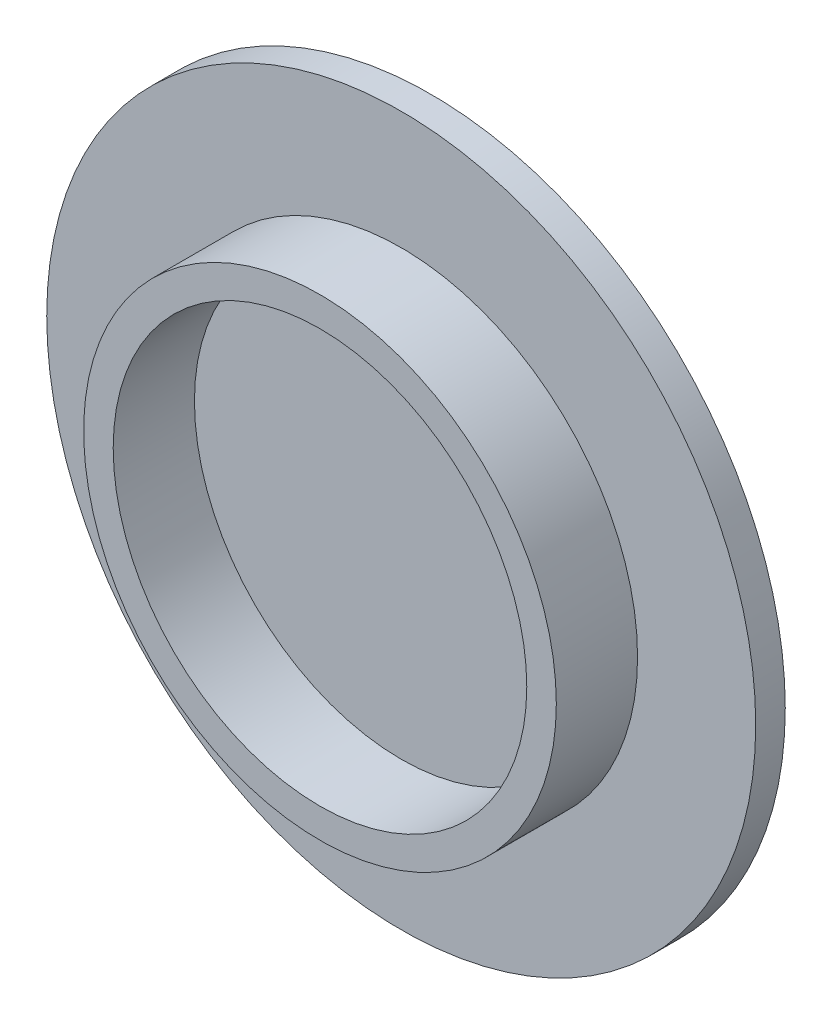
ISO-10303-21;
HEADER;
FILE_DESCRIPTION(('STEP AP214'),'2;1');
FILE_NAME('part.step','',(''),(''),'','','');
FILE_SCHEMA(('AUTOMOTIVE_DESIGN { 1 0 10303 214 1 1 1 1 }'));
ENDSEC;
DATA;
#1=APPLICATION_CONTEXT('core data for automotive mechanical design processes');
#2=APPLICATION_PROTOCOL_DEFINITION('international standard','automotive_design',2000,#1);
#3=PRODUCT_CONTEXT('',#1,'mechanical');
#4=PRODUCT('Part','Part','',(#3));
#5=PRODUCT_RELATED_PRODUCT_CATEGORY('part','',(#4));
#6=PRODUCT_DEFINITION_FORMATION('','',#4);
#7=PRODUCT_DEFINITION_CONTEXT('part definition',#1,'design');
#8=PRODUCT_DEFINITION('design','',#6,#7);
#9=PRODUCT_DEFINITION_SHAPE('','',#8);
#10=(LENGTH_UNIT() NAMED_UNIT(*) SI_UNIT(.MILLI.,.METRE.));
#11=(NAMED_UNIT(*) PLANE_ANGLE_UNIT() SI_UNIT($,.RADIAN.));
#12=(NAMED_UNIT(*) SI_UNIT($,.STERADIAN.) SOLID_ANGLE_UNIT());
#13=UNCERTAINTY_MEASURE_WITH_UNIT(LENGTH_MEASURE(1.E-05),#10,'distance_accuracy_value','');
#14=(GEOMETRIC_REPRESENTATION_CONTEXT(3) GLOBAL_UNCERTAINTY_ASSIGNED_CONTEXT((#13)) GLOBAL_UNIT_ASSIGNED_CONTEXT((#10,
#11,#12)) REPRESENTATION_CONTEXT('',''));
#15=CARTESIAN_POINT('',(0.,0.,0.));
#16=DIRECTION('',(0.,0.,1.));
#17=DIRECTION('',(1.,0.,0.));
#18=AXIS2_PLACEMENT_3D('',#15,#16,#17);
#19=CARTESIAN_POINT('',(0.,0.,10.));
#20=DIRECTION('',(0.,0.,1.));
#21=DIRECTION('',(1.,0.,0.));
#22=AXIS2_PLACEMENT_3D('',#19,#20,#21);
#23=PLANE('',#22);
#24=CARTESIAN_POINT('',(0.,0.,10.));
#25=DIRECTION('',(0.,0.,1.));
#26=DIRECTION('',(1.,0.,0.));
#27=AXIS2_PLACEMENT_3D('',#24,#25,#26);
#28=CIRCLE('',#27,120.);
#29=CARTESIAN_POINT('',(120.,0.,10.));
#30=VERTEX_POINT('',#29);
#31=EDGE_CURVE('E49',#30,#30,#28,.T.);
#32=ORIENTED_EDGE('',*,*,#31,.T.);
#33=EDGE_LOOP('',(#32));
#34=FACE_BOUND('',#33,.T.);
#35=CARTESIAN_POINT('',(0.,0.,10.));
#36=DIRECTION('',(0.,0.,1.));
#37=DIRECTION('',(1.,0.,0.));
#38=AXIS2_PLACEMENT_3D('',#35,#36,#37);
#39=CIRCLE('',#38,80.);
#40=CARTESIAN_POINT('',(80.,0.,10.));
#41=VERTEX_POINT('',#40);
#42=EDGE_CURVE('E62',#41,#41,#39,.T.);
#43=ORIENTED_EDGE('',*,*,#42,.F.);
#44=EDGE_LOOP('',(#43));
#45=FACE_BOUND('',#44,.T.);
#46=ADVANCED_FACE('F41',(#34,#45),#23,.T.);
#47=CARTESIAN_POINT('',(0.,0.,10.));
#48=DIRECTION('',(0.,0.,-1.));
#49=DIRECTION('',(-1.,0.,0.));
#50=AXIS2_PLACEMENT_3D('',#47,#48,#49);
#51=CYLINDRICAL_SURFACE('',#50,120.);
#52=ORIENTED_EDGE('',*,*,#31,.F.);
#53=EDGE_LOOP('',(#52));
#54=FACE_BOUND('',#53,.T.);
#55=CARTESIAN_POINT('',(0.,0.,0.));
#56=DIRECTION('',(0.,0.,1.));
#57=DIRECTION('',(1.,0.,0.));
#58=AXIS2_PLACEMENT_3D('',#55,#56,#57);
#59=CIRCLE('',#58,120.);
#60=CARTESIAN_POINT('',(120.,0.,0.));
#61=VERTEX_POINT('',#60);
#62=EDGE_CURVE('E54',#61,#61,#59,.T.);
#63=ORIENTED_EDGE('',*,*,#62,.T.);
#64=EDGE_LOOP('',(#63));
#65=FACE_BOUND('',#64,.T.);
#66=ADVANCED_FACE('F43',(#54,#65),#51,.T.);
#67=CARTESIAN_POINT('',(0.,0.,0.));
#68=DIRECTION('',(0.,0.,1.));
#69=DIRECTION('',(1.,0.,0.));
#70=AXIS2_PLACEMENT_3D('',#67,#68,#69);
#71=PLANE('',#70);
#72=ORIENTED_EDGE('',*,*,#62,.F.);
#73=EDGE_LOOP('',(#72));
#74=FACE_BOUND('',#73,.T.);
#75=ADVANCED_FACE('F79',(#74),#71,.F.);
#76=CARTESIAN_POINT('',(0.,0.,37.5));
#77=DIRECTION('',(0.,0.,1.));
#78=DIRECTION('',(1.,0.,0.));
#79=AXIS2_PLACEMENT_3D('',#76,#77,#78);
#80=PLANE('',#79);
#81=CARTESIAN_POINT('',(0.,0.,37.5));
#82=DIRECTION('',(0.,0.,1.));
#83=DIRECTION('',(1.,0.,0.));
#84=AXIS2_PLACEMENT_3D('',#81,#82,#83);
#85=CIRCLE('',#84,80.);
#86=CARTESIAN_POINT('',(80.,0.,37.5));
#87=VERTEX_POINT('',#86);
#88=EDGE_CURVE('E60',#87,#87,#85,.T.);
#89=ORIENTED_EDGE('',*,*,#88,.T.);
#90=EDGE_LOOP('',(#89));
#91=FACE_BOUND('',#90,.T.);
#92=CARTESIAN_POINT('',(0.,0.,37.5));
#93=DIRECTION('',(0.,0.,1.));
#94=DIRECTION('',(1.,0.,0.));
#95=AXIS2_PLACEMENT_3D('',#92,#93,#94);
#96=CIRCLE('',#95,70.);
#97=CARTESIAN_POINT('',(70.,0.,37.5));
#98=VERTEX_POINT('',#97);
#99=EDGE_CURVE('E66',#98,#98,#96,.T.);
#100=ORIENTED_EDGE('',*,*,#99,.F.);
#101=EDGE_LOOP('',(#100));
#102=FACE_BOUND('',#101,.T.);
#103=ADVANCED_FACE('F76',(#91,#102),#80,.T.);
#104=CARTESIAN_POINT('',(0.,0.,37.5));
#105=DIRECTION('',(0.,0.,-1.));
#106=DIRECTION('',(-1.,0.,0.));
#107=AXIS2_PLACEMENT_3D('',#104,#105,#106);
#108=CYLINDRICAL_SURFACE('',#107,80.);
#109=ORIENTED_EDGE('',*,*,#88,.F.);
#110=EDGE_LOOP('',(#109));
#111=FACE_BOUND('',#110,.T.);
#112=ORIENTED_EDGE('',*,*,#42,.T.);
#113=EDGE_LOOP('',(#112));
#114=FACE_BOUND('',#113,.T.);
#115=ADVANCED_FACE('F78',(#111,#114),#108,.T.);
#116=CARTESIAN_POINT('',(0.,0.,37.5));
#117=DIRECTION('',(0.,0.,-1.));
#118=DIRECTION('',(-1.,0.,0.));
#119=AXIS2_PLACEMENT_3D('',#116,#117,#118);
#120=CYLINDRICAL_SURFACE('',#119,70.);
#121=ORIENTED_EDGE('',*,*,#99,.T.);
#122=EDGE_LOOP('',(#121));
#123=FACE_BOUND('',#122,.T.);
#124=CARTESIAN_POINT('',(0.,0.,10.));
#125=DIRECTION('',(0.,0.,1.));
#126=DIRECTION('',(1.,0.,0.));
#127=AXIS2_PLACEMENT_3D('',#124,#125,#126);
#128=CIRCLE('',#127,70.);
#129=CARTESIAN_POINT('',(70.,0.,10.));
#130=VERTEX_POINT('',#129);
#131=EDGE_CURVE('E10',#130,#130,#128,.F.);
#132=ORIENTED_EDGE('',*,*,#131,.T.);
#133=EDGE_LOOP('',(#132));
#134=FACE_BOUND('',#133,.T.);
#135=ADVANCED_FACE('F74',(#123,#134),#120,.F.);
#136=ORIENTED_EDGE('',*,*,#131,.F.);
#137=EDGE_LOOP('',(#136));
#138=FACE_BOUND('',#137,.T.);
#139=ADVANCED_FACE('F92',(#138),#23,.T.);
#140=CLOSED_SHELL('',(#46,#66,#75,#103,#115,#135,#139));
#141=MANIFOLD_SOLID_BREP('B2',#140);
#142=ADVANCED_BREP_SHAPE_REPRESENTATION('',(#18,#141),#14);
#143=SHAPE_DEFINITION_REPRESENTATION(#9,#142);
ENDSEC;
END-ISO-10303-21;
